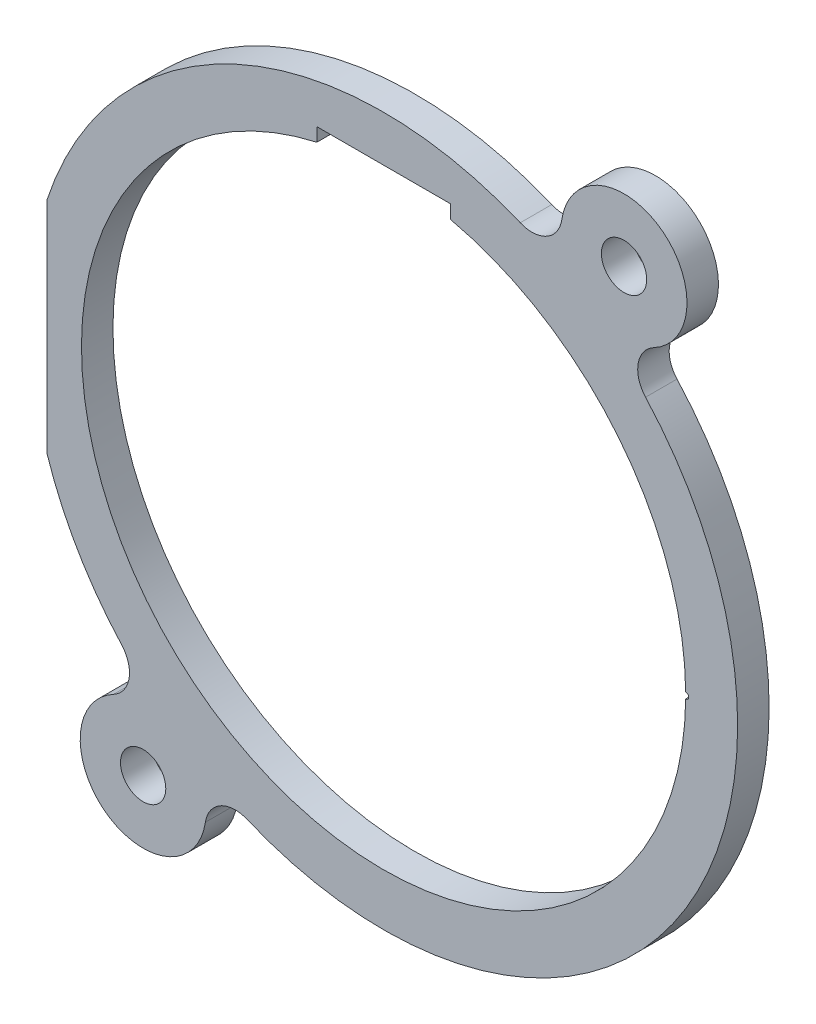
ISO-10303-21;
HEADER;
FILE_DESCRIPTION(('STEP AP214'),'2;1');
FILE_NAME('part.step','',(''),(''),'','','');
FILE_SCHEMA(('AUTOMOTIVE_DESIGN { 1 0 10303 214 1 1 1 1 }'));
ENDSEC;
DATA;
#1=APPLICATION_CONTEXT('core data for automotive mechanical design processes');
#2=APPLICATION_PROTOCOL_DEFINITION('international standard','automotive_design',2000,#1);
#3=PRODUCT_CONTEXT('',#1,'mechanical');
#4=PRODUCT('Part','Part','',(#3));
#5=PRODUCT_RELATED_PRODUCT_CATEGORY('part','',(#4));
#6=PRODUCT_DEFINITION_FORMATION('','',#4);
#7=PRODUCT_DEFINITION_CONTEXT('part definition',#1,'design');
#8=PRODUCT_DEFINITION('design','',#6,#7);
#9=PRODUCT_DEFINITION_SHAPE('','',#8);
#10=(LENGTH_UNIT() NAMED_UNIT(*) SI_UNIT(.MILLI.,.METRE.));
#11=(NAMED_UNIT(*) PLANE_ANGLE_UNIT() SI_UNIT($,.RADIAN.));
#12=(NAMED_UNIT(*) SI_UNIT($,.STERADIAN.) SOLID_ANGLE_UNIT());
#13=UNCERTAINTY_MEASURE_WITH_UNIT(LENGTH_MEASURE(1.E-05),#10,'distance_accuracy_value','');
#14=(GEOMETRIC_REPRESENTATION_CONTEXT(3) GLOBAL_UNCERTAINTY_ASSIGNED_CONTEXT((#13)) GLOBAL_UNIT_ASSIGNED_CONTEXT((#10,
#11,#12)) REPRESENTATION_CONTEXT('',''));
#15=CARTESIAN_POINT('',(0.,0.,0.));
#16=DIRECTION('',(0.,0.,1.));
#17=DIRECTION('',(1.,0.,0.));
#18=AXIS2_PLACEMENT_3D('',#15,#16,#17);
#19=CARTESIAN_POINT('',(15.24,0.,1.5875));
#20=DIRECTION('',(0.,0.,-1.));
#21=DIRECTION('',(-1.,0.,0.));
#22=AXIS2_PLACEMENT_3D('',#19,#20,#21);
#23=CYLINDRICAL_SURFACE('',#22,0.1524);
#24=CARTESIAN_POINT('',(15.24,0.,0.));
#25=DIRECTION('',(0.,0.,1.));
#26=DIRECTION('',(1.,0.,0.));
#27=AXIS2_PLACEMENT_3D('',#24,#25,#26);
#28=CIRCLE('',#27,0.1524);
#29=CARTESIAN_POINT('',(15.239238,-0.15239809498807,0.));
#30=VERTEX_POINT('',#29);
#31=CARTESIAN_POINT('',(15.239238,0.15239809498807,0.));
#32=VERTEX_POINT('',#31);
#33=EDGE_CURVE('E227',#30,#32,#28,.T.);
#34=ORIENTED_EDGE('',*,*,#33,.F.);
#35=DIRECTION('',(0.,0.,-1.));
#36=VECTOR('',#35,1.);
#37=CARTESIAN_POINT('',(15.239238,-0.15239809498807,1.5875));
#38=LINE('',#37,#36);
#39=CARTESIAN_POINT('',(15.239238,-0.15239809498807,1.5875));
#40=VERTEX_POINT('',#39);
#41=EDGE_CURVE('E11',#40,#30,#38,.T.);
#42=ORIENTED_EDGE('',*,*,#41,.F.);
#43=CARTESIAN_POINT('',(15.24,0.,1.5875));
#44=DIRECTION('',(0.,0.,1.));
#45=DIRECTION('',(1.,0.,0.));
#46=AXIS2_PLACEMENT_3D('',#43,#44,#45);
#47=CIRCLE('',#46,0.1524);
#48=CARTESIAN_POINT('',(15.239238,0.15239809498807,1.5875));
#49=VERTEX_POINT('',#48);
#50=EDGE_CURVE('E263',#40,#49,#47,.T.);
#51=ORIENTED_EDGE('',*,*,#50,.T.);
#52=DIRECTION('',(0.,0.,-1.));
#53=VECTOR('',#52,1.);
#54=CARTESIAN_POINT('',(15.239238,0.15239809498807,1.5875));
#55=LINE('',#54,#53);
#56=EDGE_CURVE('E54',#49,#32,#55,.T.);
#57=ORIENTED_EDGE('',*,*,#56,.T.);
#58=EDGE_LOOP('',(#34,#42,#51,#57));
#59=FACE_BOUND('',#58,.T.);
#60=ADVANCED_FACE('F35',(#59),#23,.F.);
#61=CARTESIAN_POINT('',(0.,0.,1.5875));
#62=DIRECTION('',(0.,0.,-1.));
#63=DIRECTION('',(-1.,0.,0.));
#64=AXIS2_PLACEMENT_3D('',#61,#62,#63);
#65=CYLINDRICAL_SURFACE('',#64,15.24);
#66=CARTESIAN_POINT('',(0.,0.,0.));
#67=DIRECTION('',(0.,0.,1.));
#68=DIRECTION('',(1.,0.,0.));
#69=AXIS2_PLACEMENT_3D('',#66,#67,#68);
#70=CIRCLE('',#69,15.24);
#71=CARTESIAN_POINT('',(-3.3655,14.8637481729879,0.));
#72=VERTEX_POINT('',#71);
#73=EDGE_CURVE('E224',#72,#30,#70,.T.);
#74=ORIENTED_EDGE('',*,*,#73,.F.);
#75=DIRECTION('',(0.,0.,-1.));
#76=VECTOR('',#75,1.);
#77=CARTESIAN_POINT('',(-3.3655,14.8637481729879,1.5875));
#78=LINE('',#77,#76);
#79=CARTESIAN_POINT('',(-3.3655,14.8637481729879,1.5875));
#80=VERTEX_POINT('',#79);
#81=EDGE_CURVE('E45',#80,#72,#78,.T.);
#82=ORIENTED_EDGE('',*,*,#81,.F.);
#83=CARTESIAN_POINT('',(0.,0.,1.5875));
#84=DIRECTION('',(0.,0.,1.));
#85=DIRECTION('',(1.,0.,0.));
#86=AXIS2_PLACEMENT_3D('',#83,#84,#85);
#87=CIRCLE('',#86,15.24);
#88=EDGE_CURVE('E260',#80,#40,#87,.T.);
#89=ORIENTED_EDGE('',*,*,#88,.T.);
#90=ORIENTED_EDGE('',*,*,#41,.T.);
#91=EDGE_LOOP('',(#74,#82,#89,#90));
#92=FACE_BOUND('',#91,.T.);
#93=ADVANCED_FACE('F343',(#92),#65,.F.);
#94=CARTESIAN_POINT('',(-3.36549999999999,0.,1.5875));
#95=DIRECTION('',(1.,0.,0.));
#96=DIRECTION('',(0.,1.,0.));
#97=AXIS2_PLACEMENT_3D('',#94,#95,#96);
#98=PLANE('',#97);
#99=DIRECTION('',(0.,-1.,0.));
#100=VECTOR('',#99,1.);
#101=CARTESIAN_POINT('',(-3.36549999999999,0.,0.));
#102=LINE('',#101,#100);
#103=CARTESIAN_POINT('',(-3.3655,15.5448,0.));
#104=VERTEX_POINT('',#103);
#105=EDGE_CURVE('E221',#104,#72,#102,.T.);
#106=ORIENTED_EDGE('',*,*,#105,.F.);
#107=DIRECTION('',(0.,0.,-1.));
#108=VECTOR('',#107,1.);
#109=CARTESIAN_POINT('',(-3.3655,15.5448,1.5875));
#110=LINE('',#109,#108);
#111=CARTESIAN_POINT('',(-3.3655,15.5448,1.5875));
#112=VERTEX_POINT('',#111);
#113=EDGE_CURVE('E179',#112,#104,#110,.T.);
#114=ORIENTED_EDGE('',*,*,#113,.F.);
#115=DIRECTION('',(0.,-1.,0.));
#116=VECTOR('',#115,1.);
#117=CARTESIAN_POINT('',(-3.36549999999999,0.,1.5875));
#118=LINE('',#117,#116);
#119=EDGE_CURVE('E173',#112,#80,#118,.T.);
#120=ORIENTED_EDGE('',*,*,#119,.T.);
#121=ORIENTED_EDGE('',*,*,#81,.T.);
#122=EDGE_LOOP('',(#106,#114,#120,#121));
#123=FACE_BOUND('',#122,.T.);
#124=ADVANCED_FACE('F351',(#123),#98,.T.);
#125=CARTESIAN_POINT('',(0.,15.5448,1.5875));
#126=DIRECTION('',(0.,1.,0.));
#127=DIRECTION('',(0.,0.,1.));
#128=AXIS2_PLACEMENT_3D('',#125,#126,#127);
#129=PLANE('',#128);
#130=DIRECTION('',(1.,0.,0.));
#131=VECTOR('',#130,1.);
#132=CARTESIAN_POINT('',(0.,15.5448,0.));
#133=LINE('',#132,#131);
#134=CARTESIAN_POINT('',(3.3655,15.5448,0.));
#135=VERTEX_POINT('',#134);
#136=EDGE_CURVE('E178',#104,#135,#133,.T.);
#137=ORIENTED_EDGE('',*,*,#136,.T.);
#138=DIRECTION('',(0.,0.,-1.));
#139=VECTOR('',#138,1.);
#140=CARTESIAN_POINT('',(3.3655,15.5448,1.5875));
#141=LINE('',#140,#139);
#142=CARTESIAN_POINT('',(3.3655,15.5448,1.5875));
#143=VERTEX_POINT('',#142);
#144=EDGE_CURVE('E159',#143,#135,#141,.T.);
#145=ORIENTED_EDGE('',*,*,#144,.F.);
#146=DIRECTION('',(1.,0.,0.));
#147=VECTOR('',#146,1.);
#148=CARTESIAN_POINT('',(0.,15.5448,1.5875));
#149=LINE('',#148,#147);
#150=EDGE_CURVE('E164',#112,#143,#149,.T.);
#151=ORIENTED_EDGE('',*,*,#150,.F.);
#152=ORIENTED_EDGE('',*,*,#113,.T.);
#153=EDGE_LOOP('',(#137,#145,#151,#152));
#154=FACE_BOUND('',#153,.T.);
#155=ADVANCED_FACE('F176',(#154),#129,.F.);
#156=CARTESIAN_POINT('',(3.36549999999999,0.,1.5875));
#157=DIRECTION('',(1.,0.,0.));
#158=DIRECTION('',(0.,1.,0.));
#159=AXIS2_PLACEMENT_3D('',#156,#157,#158);
#160=PLANE('',#159);
#161=DIRECTION('',(0.,-1.,0.));
#162=VECTOR('',#161,1.);
#163=CARTESIAN_POINT('',(3.36549999999999,0.,0.));
#164=LINE('',#163,#162);
#165=CARTESIAN_POINT('',(3.3655,14.8637481729879,0.));
#166=VERTEX_POINT('',#165);
#167=EDGE_CURVE('E218',#135,#166,#164,.T.);
#168=ORIENTED_EDGE('',*,*,#167,.T.);
#169=DIRECTION('',(0.,0.,-1.));
#170=VECTOR('',#169,1.);
#171=CARTESIAN_POINT('',(3.3655,14.8637481729879,1.5875));
#172=LINE('',#171,#170);
#173=CARTESIAN_POINT('',(3.3655,14.8637481729879,1.5875));
#174=VERTEX_POINT('',#173);
#175=EDGE_CURVE('E104',#174,#166,#172,.T.);
#176=ORIENTED_EDGE('',*,*,#175,.F.);
#177=DIRECTION('',(0.,-1.,0.));
#178=VECTOR('',#177,1.);
#179=CARTESIAN_POINT('',(3.36549999999999,0.,1.5875));
#180=LINE('',#179,#178);
#181=EDGE_CURVE('E155',#143,#174,#180,.T.);
#182=ORIENTED_EDGE('',*,*,#181,.F.);
#183=ORIENTED_EDGE('',*,*,#144,.T.);
#184=EDGE_LOOP('',(#168,#176,#182,#183));
#185=FACE_BOUND('',#184,.T.);
#186=ADVANCED_FACE('F157',(#185),#160,.F.);
#187=CARTESIAN_POINT('',(14.3419313126473,13.0402111708115,1.5875));
#188=DIRECTION('',(0.,0.,-1.));
#189=DIRECTION('',(-1.,0.,0.));
#190=AXIS2_PLACEMENT_3D('',#187,#188,#189);
#191=CYLINDRICAL_SURFACE('',#190,1.524);
#192=CARTESIAN_POINT('',(14.3419313126473,13.0402111708115,0.));
#193=DIRECTION('',(0.,0.,1.));
#194=DIRECTION('',(1.,0.,0.));
#195=AXIS2_PLACEMENT_3D('',#192,#193,#194);
#196=CIRCLE('',#195,1.524);
#197=CARTESIAN_POINT('',(13.624339722462,14.3846955737316,0.));
#198=VERTEX_POINT('',#197);
#199=CARTESIAN_POINT('',(13.214344502555,12.0149677920444,0.));
#200=VERTEX_POINT('',#199);
#201=EDGE_CURVE('E251',#198,#200,#196,.T.);
#202=ORIENTED_EDGE('',*,*,#201,.F.);
#203=DIRECTION('',(0.,0.,-1.));
#204=VECTOR('',#203,1.);
#205=CARTESIAN_POINT('',(13.624339722462,14.3846955737316,1.5875));
#206=LINE('',#205,#204);
#207=CARTESIAN_POINT('',(13.624339722462,14.3846955737316,1.5875));
#208=VERTEX_POINT('',#207);
#209=EDGE_CURVE('E39',#208,#198,#206,.T.);
#210=ORIENTED_EDGE('',*,*,#209,.F.);
#211=CARTESIAN_POINT('',(14.3419313126473,13.0402111708115,1.5875));
#212=DIRECTION('',(0.,0.,1.));
#213=DIRECTION('',(1.,0.,0.));
#214=AXIS2_PLACEMENT_3D('',#211,#212,#213);
#215=CIRCLE('',#214,1.524);
#216=CARTESIAN_POINT('',(13.214344502555,12.0149677920444,1.5875));
#217=VERTEX_POINT('',#216);
#218=EDGE_CURVE('E285',#208,#217,#215,.T.);
#219=ORIENTED_EDGE('',*,*,#218,.T.);
#220=DIRECTION('',(0.,0.,-1.));
#221=VECTOR('',#220,1.);
#222=CARTESIAN_POINT('',(13.214344502555,12.0149677920444,1.5875));
#223=LINE('',#222,#221);
#224=EDGE_CURVE('E186',#217,#200,#223,.T.);
#225=ORIENTED_EDGE('',*,*,#224,.T.);
#226=EDGE_LOOP('',(#202,#210,#219,#225));
#227=FACE_BOUND('',#226,.T.);
#228=ADVANCED_FACE('F302',(#227),#191,.F.);
#229=CARTESIAN_POINT('',(12.1293572429093,17.1857047464818,1.5875));
#230=DIRECTION('',(0.,0.,-1.));
#231=DIRECTION('',(-1.,0.,0.));
#232=AXIS2_PLACEMENT_3D('',#229,#230,#231);
#233=CYLINDRICAL_SURFACE('',#232,3.175);
#234=CARTESIAN_POINT('',(12.1293572429093,17.1857047464818,0.));
#235=DIRECTION('',(0.,0.,1.));
#236=DIRECTION('',(1.,0.,0.));
#237=AXIS2_PLACEMENT_3D('',#234,#235,#236);
#238=CIRCLE('',#237,3.175);
#239=CARTESIAN_POINT('',(8.98937675052157,17.6559679785384,0.));
#240=VERTEX_POINT('',#239);
#241=EDGE_CURVE('E249',#198,#240,#238,.T.);
#242=ORIENTED_EDGE('',*,*,#241,.T.);
#243=DIRECTION('',(0.,0.,-1.));
#244=VECTOR('',#243,1.);
#245=CARTESIAN_POINT('',(8.98937675052157,17.6559679785384,1.5875));
#246=LINE('',#245,#244);
#247=CARTESIAN_POINT('',(8.98937675052157,17.6559679785384,1.5875));
#248=VERTEX_POINT('',#247);
#249=EDGE_CURVE('E204',#248,#240,#246,.T.);
#250=ORIENTED_EDGE('',*,*,#249,.F.);
#251=CARTESIAN_POINT('',(12.1293572429093,17.1857047464818,1.5875));
#252=DIRECTION('',(0.,0.,1.));
#253=DIRECTION('',(1.,0.,0.));
#254=AXIS2_PLACEMENT_3D('',#251,#252,#253);
#255=CIRCLE('',#254,3.175);
#256=EDGE_CURVE('E283',#208,#248,#255,.T.);
#257=ORIENTED_EDGE('',*,*,#256,.F.);
#258=ORIENTED_EDGE('',*,*,#209,.T.);
#259=EDGE_LOOP('',(#242,#250,#257,#258));
#260=FACE_BOUND('',#259,.T.);
#261=ADVANCED_FACE('F311',(#260),#233,.T.);
#262=CARTESIAN_POINT('',(7.48218611417545,17.8816943299255,1.5875));
#263=DIRECTION('',(0.,0.,-1.));
#264=DIRECTION('',(-1.,0.,0.));
#265=AXIS2_PLACEMENT_3D('',#262,#263,#264);
#266=CYLINDRICAL_SURFACE('',#265,1.524);
#267=CARTESIAN_POINT('',(7.48218611417545,17.8816943299255,0.));
#268=DIRECTION('',(0.,0.,1.));
#269=DIRECTION('',(1.,0.,0.));
#270=AXIS2_PLACEMENT_3D('',#267,#268,#269);
#271=CIRCLE('',#270,1.524);
#272=CARTESIAN_POINT('',(6.89392403223674,16.4758053858929,0.));
#273=VERTEX_POINT('',#272);
#274=EDGE_CURVE('E246',#273,#240,#271,.T.);
#275=ORIENTED_EDGE('',*,*,#274,.F.);
#276=DIRECTION('',(0.,0.,-1.));
#277=VECTOR('',#276,1.);
#278=CARTESIAN_POINT('',(6.89392403223674,16.4758053858929,1.5875));
#279=LINE('',#278,#277);
#280=CARTESIAN_POINT('',(6.89392403223674,16.4758053858929,1.5875));
#281=VERTEX_POINT('',#280);
#282=EDGE_CURVE('E203',#281,#273,#279,.T.);
#283=ORIENTED_EDGE('',*,*,#282,.F.);
#284=CARTESIAN_POINT('',(7.48218611417545,17.8816943299255,1.5875));
#285=DIRECTION('',(0.,0.,1.));
#286=DIRECTION('',(1.,0.,0.));
#287=AXIS2_PLACEMENT_3D('',#284,#285,#286);
#288=CIRCLE('',#287,1.524);
#289=EDGE_CURVE('E281',#281,#248,#288,.T.);
#290=ORIENTED_EDGE('',*,*,#289,.T.);
#291=ORIENTED_EDGE('',*,*,#249,.T.);
#292=EDGE_LOOP('',(#275,#283,#290,#291));
#293=FACE_BOUND('',#292,.T.);
#294=ADVANCED_FACE('F312',(#293),#266,.F.);
#295=CARTESIAN_POINT('',(0.,0.,1.5875));
#296=DIRECTION('',(0.,0.,-1.));
#297=DIRECTION('',(-1.,0.,0.));
#298=AXIS2_PLACEMENT_3D('',#295,#296,#297);
#299=CYLINDRICAL_SURFACE('',#298,17.8599650524873);
#300=CARTESIAN_POINT('',(0.,0.,0.));
#301=DIRECTION('',(0.,0.,1.));
#302=DIRECTION('',(1.,0.,0.));
#303=AXIS2_PLACEMENT_3D('',#300,#301,#302);
#304=CIRCLE('',#303,17.8599650524873);
#305=CARTESIAN_POINT('',(-16.9840587441892,5.52450000000002,0.));
#306=VERTEX_POINT('',#305);
#307=EDGE_CURVE('E243',#273,#306,#304,.T.);
#308=ORIENTED_EDGE('',*,*,#307,.T.);
#309=DIRECTION('',(0.,0.,-1.));
#310=VECTOR('',#309,1.);
#311=CARTESIAN_POINT('',(-16.9840587441892,5.52450000000002,1.5875));
#312=LINE('',#311,#310);
#313=CARTESIAN_POINT('',(-16.9840587441892,5.52450000000002,1.5875));
#314=VERTEX_POINT('',#313);
#315=EDGE_CURVE('E200',#314,#306,#312,.T.);
#316=ORIENTED_EDGE('',*,*,#315,.F.);
#317=CARTESIAN_POINT('',(0.,0.,1.5875));
#318=DIRECTION('',(0.,0.,1.));
#319=DIRECTION('',(1.,0.,0.));
#320=AXIS2_PLACEMENT_3D('',#317,#318,#319);
#321=CIRCLE('',#320,17.8599650524873);
#322=EDGE_CURVE('E278',#281,#314,#321,.T.);
#323=ORIENTED_EDGE('',*,*,#322,.F.);
#324=ORIENTED_EDGE('',*,*,#282,.T.);
#325=EDGE_LOOP('',(#308,#316,#323,#324));
#326=FACE_BOUND('',#325,.T.);
#327=ADVANCED_FACE('F317',(#326),#299,.T.);
#328=CARTESIAN_POINT('',(-16.9840587441892,0.,1.5875));
#329=DIRECTION('',(1.,0.,0.));
#330=DIRECTION('',(0.,0.,-1.));
#331=AXIS2_PLACEMENT_3D('',#328,#329,#330);
#332=PLANE('',#331);
#333=DIRECTION('',(0.,-1.,0.));
#334=VECTOR('',#333,1.);
#335=CARTESIAN_POINT('',(-16.9840587441892,0.,0.));
#336=LINE('',#335,#334);
#337=CARTESIAN_POINT('',(-16.9840587441892,-5.5245,0.));
#338=VERTEX_POINT('',#337);
#339=EDGE_CURVE('E240',#306,#338,#336,.T.);
#340=ORIENTED_EDGE('',*,*,#339,.T.);
#341=DIRECTION('',(0.,0.,-1.));
#342=VECTOR('',#341,1.);
#343=CARTESIAN_POINT('',(-16.9840587441892,-5.5245,1.5875));
#344=LINE('',#343,#342);
#345=CARTESIAN_POINT('',(-16.9840587441892,-5.5245,1.5875));
#346=VERTEX_POINT('',#345);
#347=EDGE_CURVE('E197',#346,#338,#344,.T.);
#348=ORIENTED_EDGE('',*,*,#347,.F.);
#349=DIRECTION('',(0.,-1.,0.));
#350=VECTOR('',#349,1.);
#351=CARTESIAN_POINT('',(-16.9840587441892,0.,1.5875));
#352=LINE('',#351,#350);
#353=EDGE_CURVE('E275',#314,#346,#352,.T.);
#354=ORIENTED_EDGE('',*,*,#353,.F.);
#355=ORIENTED_EDGE('',*,*,#315,.T.);
#356=EDGE_LOOP('',(#340,#348,#354,#355));
#357=FACE_BOUND('',#356,.T.);
#358=ADVANCED_FACE('F319',(#357),#332,.F.);
#359=CARTESIAN_POINT('',(-13.214344502555,-12.0149677920444,0.));
#360=VERTEX_POINT('',#359);
#361=EDGE_CURVE('E239',#338,#360,#304,.T.);
#362=ORIENTED_EDGE('',*,*,#361,.T.);
#363=DIRECTION('',(0.,0.,-1.));
#364=VECTOR('',#363,1.);
#365=CARTESIAN_POINT('',(-13.214344502555,-12.0149677920444,1.5875));
#366=LINE('',#365,#364);
#367=CARTESIAN_POINT('',(-13.214344502555,-12.0149677920444,1.5875));
#368=VERTEX_POINT('',#367);
#369=EDGE_CURVE('E195',#368,#360,#366,.T.);
#370=ORIENTED_EDGE('',*,*,#369,.F.);
#371=EDGE_CURVE('E274',#346,#368,#321,.T.);
#372=ORIENTED_EDGE('',*,*,#371,.F.);
#373=ORIENTED_EDGE('',*,*,#347,.T.);
#374=EDGE_LOOP('',(#362,#370,#372,#373));
#375=FACE_BOUND('',#374,.T.);
#376=ADVANCED_FACE('F322',(#375),#299,.T.);
#377=CARTESIAN_POINT('',(-14.3419313126473,-13.0402111708115,1.5875));
#378=DIRECTION('',(0.,0.,-1.));
#379=DIRECTION('',(-1.,0.,0.));
#380=AXIS2_PLACEMENT_3D('',#377,#378,#379);
#381=CYLINDRICAL_SURFACE('',#380,1.524);
#382=CARTESIAN_POINT('',(-14.3419313126473,-13.0402111708115,0.));
#383=DIRECTION('',(0.,0.,1.));
#384=DIRECTION('',(1.,0.,0.));
#385=AXIS2_PLACEMENT_3D('',#382,#383,#384);
#386=CIRCLE('',#385,1.524);
#387=CARTESIAN_POINT('',(-13.624339722462,-14.3846955737316,0.));
#388=VERTEX_POINT('',#387);
#389=EDGE_CURVE('E236',#388,#360,#386,.T.);
#390=ORIENTED_EDGE('',*,*,#389,.F.);
#391=DIRECTION('',(0.,0.,-1.));
#392=VECTOR('',#391,1.);
#393=CARTESIAN_POINT('',(-13.624339722462,-14.3846955737316,1.5875));
#394=LINE('',#393,#392);
#395=CARTESIAN_POINT('',(-13.624339722462,-14.3846955737316,1.5875));
#396=VERTEX_POINT('',#395);
#397=EDGE_CURVE('E193',#396,#388,#394,.T.);
#398=ORIENTED_EDGE('',*,*,#397,.F.);
#399=CARTESIAN_POINT('',(-14.3419313126473,-13.0402111708115,1.5875));
#400=DIRECTION('',(0.,0.,1.));
#401=DIRECTION('',(1.,0.,0.));
#402=AXIS2_PLACEMENT_3D('',#399,#400,#401);
#403=CIRCLE('',#402,1.524);
#404=EDGE_CURVE('E271',#396,#368,#403,.T.);
#405=ORIENTED_EDGE('',*,*,#404,.T.);
#406=ORIENTED_EDGE('',*,*,#369,.T.);
#407=EDGE_LOOP('',(#390,#398,#405,#406));
#408=FACE_BOUND('',#407,.T.);
#409=ADVANCED_FACE('F329',(#408),#381,.F.);
#410=CARTESIAN_POINT('',(-12.1293572429094,-17.1857047464818,1.5875));
#411=DIRECTION('',(0.,0.,-1.));
#412=DIRECTION('',(-1.,0.,0.));
#413=AXIS2_PLACEMENT_3D('',#410,#411,#412);
#414=CYLINDRICAL_SURFACE('',#413,3.175);
#415=CARTESIAN_POINT('',(-12.1293572429094,-17.1857047464818,0.));
#416=DIRECTION('',(0.,0.,1.));
#417=DIRECTION('',(1.,0.,0.));
#418=AXIS2_PLACEMENT_3D('',#415,#416,#417);
#419=CIRCLE('',#418,3.175);
#420=CARTESIAN_POINT('',(-8.9893767505216,-17.6559679785384,0.));
#421=VERTEX_POINT('',#420);
#422=EDGE_CURVE('E233',#388,#421,#419,.T.);
#423=ORIENTED_EDGE('',*,*,#422,.T.);
#424=DIRECTION('',(0.,0.,-1.));
#425=VECTOR('',#424,1.);
#426=CARTESIAN_POINT('',(-8.9893767505216,-17.6559679785384,1.5875));
#427=LINE('',#426,#425);
#428=CARTESIAN_POINT('',(-8.9893767505216,-17.6559679785384,1.5875));
#429=VERTEX_POINT('',#428);
#430=EDGE_CURVE('E191',#429,#421,#427,.T.);
#431=ORIENTED_EDGE('',*,*,#430,.F.);
#432=CARTESIAN_POINT('',(-12.1293572429094,-17.1857047464818,1.5875));
#433=DIRECTION('',(0.,0.,1.));
#434=DIRECTION('',(1.,0.,0.));
#435=AXIS2_PLACEMENT_3D('',#432,#433,#434);
#436=CIRCLE('',#435,3.175);
#437=EDGE_CURVE('E269',#396,#429,#436,.T.);
#438=ORIENTED_EDGE('',*,*,#437,.F.);
#439=ORIENTED_EDGE('',*,*,#397,.T.);
#440=EDGE_LOOP('',(#423,#431,#438,#439));
#441=FACE_BOUND('',#440,.T.);
#442=ADVANCED_FACE('F332',(#441),#414,.T.);
#443=CARTESIAN_POINT('',(-7.48218611417546,-17.8816943299255,1.5875));
#444=DIRECTION('',(0.,0.,-1.));
#445=DIRECTION('',(-1.,0.,0.));
#446=AXIS2_PLACEMENT_3D('',#443,#444,#445);
#447=CYLINDRICAL_SURFACE('',#446,1.52400000000001);
#448=CARTESIAN_POINT('',(-7.48218611417546,-17.8816943299255,0.));
#449=DIRECTION('',(0.,0.,1.));
#450=DIRECTION('',(1.,0.,0.));
#451=AXIS2_PLACEMENT_3D('',#448,#449,#450);
#452=CIRCLE('',#451,1.52400000000001);
#453=CARTESIAN_POINT('',(-6.89392403223675,-16.4758053858929,0.));
#454=VERTEX_POINT('',#453);
#455=EDGE_CURVE('E230',#454,#421,#452,.T.);
#456=ORIENTED_EDGE('',*,*,#455,.F.);
#457=DIRECTION('',(0.,0.,-1.));
#458=VECTOR('',#457,1.);
#459=CARTESIAN_POINT('',(-6.89392403223675,-16.4758053858929,1.5875));
#460=LINE('',#459,#458);
#461=CARTESIAN_POINT('',(-6.89392403223675,-16.4758053858929,1.5875));
#462=VERTEX_POINT('',#461);
#463=EDGE_CURVE('E188',#462,#454,#460,.T.);
#464=ORIENTED_EDGE('',*,*,#463,.F.);
#465=CARTESIAN_POINT('',(-7.48218611417546,-17.8816943299255,1.5875));
#466=DIRECTION('',(0.,0.,1.));
#467=DIRECTION('',(1.,0.,0.));
#468=AXIS2_PLACEMENT_3D('',#465,#466,#467);
#469=CIRCLE('',#468,1.52400000000001);
#470=EDGE_CURVE('E266',#462,#429,#469,.T.);
#471=ORIENTED_EDGE('',*,*,#470,.T.);
#472=ORIENTED_EDGE('',*,*,#430,.T.);
#473=EDGE_LOOP('',(#456,#464,#471,#472));
#474=FACE_BOUND('',#473,.T.);
#475=ADVANCED_FACE('F334',(#474),#447,.F.);
#476=EDGE_CURVE('E217',#32,#166,#70,.T.);
#477=ORIENTED_EDGE('',*,*,#476,.F.);
#478=ORIENTED_EDGE('',*,*,#56,.F.);
#479=EDGE_CURVE('E163',#49,#174,#87,.T.);
#480=ORIENTED_EDGE('',*,*,#479,.T.);
#481=ORIENTED_EDGE('',*,*,#175,.T.);
#482=EDGE_LOOP('',(#477,#478,#480,#481));
#483=FACE_BOUND('',#482,.T.);
#484=ADVANCED_FACE('F336',(#483),#65,.F.);
#485=EDGE_CURVE('E229',#454,#200,#304,.T.);
#486=ORIENTED_EDGE('',*,*,#485,.T.);
#487=ORIENTED_EDGE('',*,*,#224,.F.);
#488=EDGE_CURVE('E265',#462,#217,#321,.T.);
#489=ORIENTED_EDGE('',*,*,#488,.F.);
#490=ORIENTED_EDGE('',*,*,#463,.T.);
#491=EDGE_LOOP('',(#486,#487,#489,#490));
#492=FACE_BOUND('',#491,.T.);
#493=ADVANCED_FACE('F306',(#492),#299,.T.);
#494=CARTESIAN_POINT('',(12.1293572429093,17.1857047464818,1.5875));
#495=DIRECTION('',(0.,0.,-1.));
#496=DIRECTION('',(-1.,0.,0.));
#497=AXIS2_PLACEMENT_3D('',#494,#495,#496);
#498=CYLINDRICAL_SURFACE('',#497,1.143);
#499=CARTESIAN_POINT('',(12.1293572429093,17.1857047464818,1.5875));
#500=DIRECTION('',(0.,0.,1.));
#501=DIRECTION('',(1.,0.,0.));
#502=AXIS2_PLACEMENT_3D('',#499,#500,#501);
#503=CIRCLE('',#502,1.143);
#504=CARTESIAN_POINT('',(13.2723572429093,17.1857047464818,1.5875));
#505=VERTEX_POINT('',#504);
#506=EDGE_CURVE('E216',#505,#505,#503,.T.);
#507=ORIENTED_EDGE('',*,*,#506,.T.);
#508=EDGE_LOOP('',(#507));
#509=FACE_BOUND('',#508,.T.);
#510=CARTESIAN_POINT('',(12.1293572429093,17.1857047464818,0.));
#511=DIRECTION('',(0.,0.,1.));
#512=DIRECTION('',(1.,0.,0.));
#513=AXIS2_PLACEMENT_3D('',#510,#511,#512);
#514=CIRCLE('',#513,1.143);
#515=CARTESIAN_POINT('',(13.2723572429093,17.1857047464818,0.));
#516=VERTEX_POINT('',#515);
#517=EDGE_CURVE('E254',#516,#516,#514,.T.);
#518=ORIENTED_EDGE('',*,*,#517,.F.);
#519=EDGE_LOOP('',(#518));
#520=FACE_BOUND('',#519,.T.);
#521=ADVANCED_FACE('F37',(#509,#520),#498,.F.);
#522=CARTESIAN_POINT('',(-12.1293572429094,-17.1857047464818,1.5875));
#523=DIRECTION('',(0.,0.,-1.));
#524=DIRECTION('',(-1.,0.,0.));
#525=AXIS2_PLACEMENT_3D('',#522,#523,#524);
#526=CYLINDRICAL_SURFACE('',#525,1.143);
#527=CARTESIAN_POINT('',(-12.1293572429094,-17.1857047464818,1.5875));
#528=DIRECTION('',(0.,0.,1.));
#529=DIRECTION('',(1.,0.,0.));
#530=AXIS2_PLACEMENT_3D('',#527,#528,#529);
#531=CIRCLE('',#530,1.143);
#532=CARTESIAN_POINT('',(-10.9863572429094,-17.1857047464818,1.5875));
#533=VERTEX_POINT('',#532);
#534=EDGE_CURVE('E189',#533,#533,#531,.T.);
#535=ORIENTED_EDGE('',*,*,#534,.T.);
#536=EDGE_LOOP('',(#535));
#537=FACE_BOUND('',#536,.T.);
#538=CARTESIAN_POINT('',(-12.1293572429094,-17.1857047464818,0.));
#539=DIRECTION('',(0.,0.,1.));
#540=DIRECTION('',(1.,0.,0.));
#541=AXIS2_PLACEMENT_3D('',#538,#539,#540);
#542=CIRCLE('',#541,1.143);
#543=CARTESIAN_POINT('',(-10.9863572429094,-17.1857047464818,0.));
#544=VERTEX_POINT('',#543);
#545=EDGE_CURVE('E213',#544,#544,#542,.T.);
#546=ORIENTED_EDGE('',*,*,#545,.F.);
#547=EDGE_LOOP('',(#546));
#548=FACE_BOUND('',#547,.T.);
#549=ADVANCED_FACE('F295',(#537,#548),#526,.F.);
#550=CARTESIAN_POINT('',(0.,0.,1.5875));
#551=DIRECTION('',(0.,0.,1.));
#552=DIRECTION('',(1.,0.,0.));
#553=AXIS2_PLACEMENT_3D('',#550,#551,#552);
#554=PLANE('',#553);
#555=ORIENTED_EDGE('',*,*,#506,.F.);
#556=EDGE_LOOP('',(#555));
#557=FACE_BOUND('',#556,.T.);
#558=ORIENTED_EDGE('',*,*,#218,.F.);
#559=ORIENTED_EDGE('',*,*,#256,.T.);
#560=ORIENTED_EDGE('',*,*,#289,.F.);
#561=ORIENTED_EDGE('',*,*,#322,.T.);
#562=ORIENTED_EDGE('',*,*,#353,.T.);
#563=ORIENTED_EDGE('',*,*,#371,.T.);
#564=ORIENTED_EDGE('',*,*,#404,.F.);
#565=ORIENTED_EDGE('',*,*,#437,.T.);
#566=ORIENTED_EDGE('',*,*,#470,.F.);
#567=ORIENTED_EDGE('',*,*,#488,.T.);
#568=EDGE_LOOP('',(#558,#559,#560,#561,#562,#563,#564,#565,#566,#567));
#569=FACE_BOUND('',#568,.T.);
#570=ORIENTED_EDGE('',*,*,#50,.F.);
#571=ORIENTED_EDGE('',*,*,#88,.F.);
#572=ORIENTED_EDGE('',*,*,#119,.F.);
#573=ORIENTED_EDGE('',*,*,#150,.T.);
#574=ORIENTED_EDGE('',*,*,#181,.T.);
#575=ORIENTED_EDGE('',*,*,#479,.F.);
#576=EDGE_LOOP('',(#570,#571,#572,#573,#574,#575));
#577=FACE_BOUND('',#576,.T.);
#578=ORIENTED_EDGE('',*,*,#534,.F.);
#579=EDGE_LOOP('',(#578));
#580=FACE_BOUND('',#579,.T.);
#581=ADVANCED_FACE('F169',(#557,#569,#577,#580),#554,.T.);
#582=CARTESIAN_POINT('',(0.,0.,0.));
#583=DIRECTION('',(0.,0.,1.));
#584=DIRECTION('',(1.,0.,0.));
#585=AXIS2_PLACEMENT_3D('',#582,#583,#584);
#586=PLANE('',#585);
#587=ORIENTED_EDGE('',*,*,#517,.T.);
#588=EDGE_LOOP('',(#587));
#589=FACE_BOUND('',#588,.T.);
#590=ORIENTED_EDGE('',*,*,#201,.T.);
#591=ORIENTED_EDGE('',*,*,#485,.F.);
#592=ORIENTED_EDGE('',*,*,#455,.T.);
#593=ORIENTED_EDGE('',*,*,#422,.F.);
#594=ORIENTED_EDGE('',*,*,#389,.T.);
#595=ORIENTED_EDGE('',*,*,#361,.F.);
#596=ORIENTED_EDGE('',*,*,#339,.F.);
#597=ORIENTED_EDGE('',*,*,#307,.F.);
#598=ORIENTED_EDGE('',*,*,#274,.T.);
#599=ORIENTED_EDGE('',*,*,#241,.F.);
#600=EDGE_LOOP('',(#590,#591,#592,#593,#594,#595,#596,#597,#598,#599));
#601=FACE_BOUND('',#600,.T.);
#602=ORIENTED_EDGE('',*,*,#33,.T.);
#603=ORIENTED_EDGE('',*,*,#476,.T.);
#604=ORIENTED_EDGE('',*,*,#167,.F.);
#605=ORIENTED_EDGE('',*,*,#136,.F.);
#606=ORIENTED_EDGE('',*,*,#105,.T.);
#607=ORIENTED_EDGE('',*,*,#73,.T.);
#608=EDGE_LOOP('',(#602,#603,#604,#605,#606,#607));
#609=FACE_BOUND('',#608,.T.);
#610=ORIENTED_EDGE('',*,*,#545,.T.);
#611=EDGE_LOOP('',(#610));
#612=FACE_BOUND('',#611,.T.);
#613=ADVANCED_FACE('F294',(#589,#601,#609,#612),#586,.F.);
#614=CLOSED_SHELL('',(#60,#93,#124,#155,#186,#228,#261,#294,#327,#358,#376,#409,#442,#475,#484,
#493,#521,#549,#581,#613));
#615=MANIFOLD_SOLID_BREP('B2',#614);
#616=ADVANCED_BREP_SHAPE_REPRESENTATION('',(#18,#615),#14);
#617=SHAPE_DEFINITION_REPRESENTATION(#9,#616);
ENDSEC;
END-ISO-10303-21;
